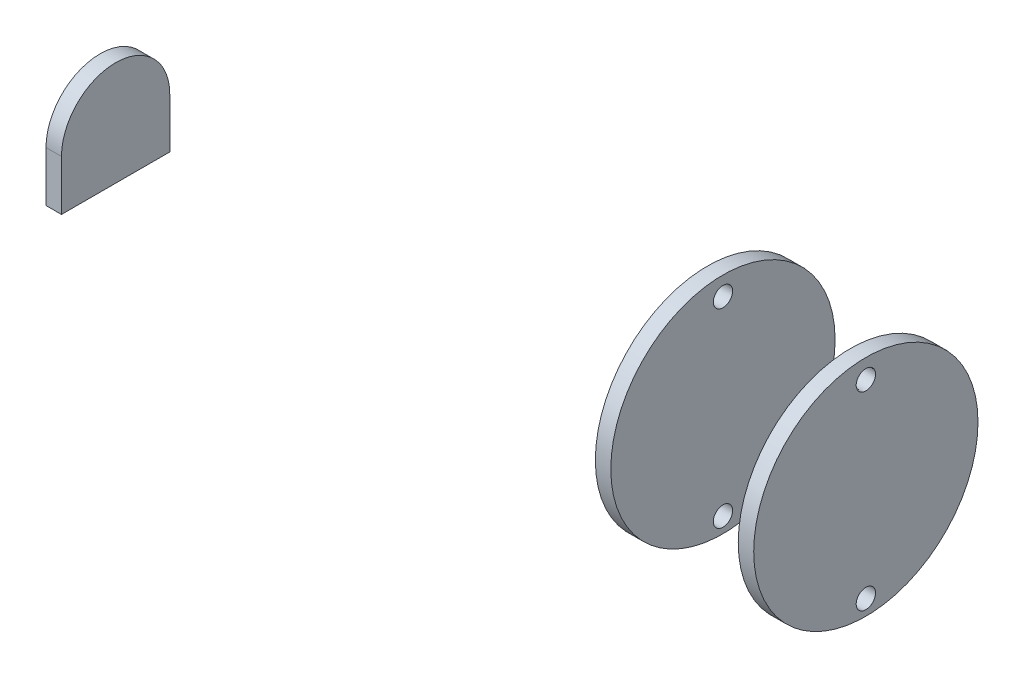
ISO-10303-21;
HEADER;
FILE_DESCRIPTION(('STEP AP214'),'2;1');
FILE_NAME('part.step','',(''),(''),'','','');
FILE_SCHEMA(('AUTOMOTIVE_DESIGN { 1 0 10303 214 1 1 1 1 }'));
ENDSEC;
DATA;
#1=APPLICATION_CONTEXT('core data for automotive mechanical design processes');
#2=APPLICATION_PROTOCOL_DEFINITION('international standard','automotive_design',2000,#1);
#3=PRODUCT_CONTEXT('',#1,'mechanical');
#4=PRODUCT('Part','Part','',(#3));
#5=PRODUCT_RELATED_PRODUCT_CATEGORY('part','',(#4));
#6=PRODUCT_DEFINITION_FORMATION('','',#4);
#7=PRODUCT_DEFINITION_CONTEXT('part definition',#1,'design');
#8=PRODUCT_DEFINITION('design','',#6,#7);
#9=PRODUCT_DEFINITION_SHAPE('','',#8);
#10=(LENGTH_UNIT() NAMED_UNIT(*) SI_UNIT(.MILLI.,.METRE.));
#11=(NAMED_UNIT(*) PLANE_ANGLE_UNIT() SI_UNIT($,.RADIAN.));
#12=(NAMED_UNIT(*) SI_UNIT($,.STERADIAN.) SOLID_ANGLE_UNIT());
#13=UNCERTAINTY_MEASURE_WITH_UNIT(LENGTH_MEASURE(1.E-05),#10,'distance_accuracy_value','');
#14=(GEOMETRIC_REPRESENTATION_CONTEXT(3) GLOBAL_UNCERTAINTY_ASSIGNED_CONTEXT((#13)) GLOBAL_UNIT_ASSIGNED_CONTEXT((#10,
#11,#12)) REPRESENTATION_CONTEXT('',''));
#15=CARTESIAN_POINT('',(0.,0.,0.));
#16=DIRECTION('',(0.,0.,1.));
#17=DIRECTION('',(1.,0.,0.));
#18=AXIS2_PLACEMENT_3D('',#15,#16,#17);
#19=CARTESIAN_POINT('',(4.,22.9784892037643,-14.));
#20=DIRECTION('',(1.,0.,0.));
#21=DIRECTION('',(0.,0.,-1.));
#22=AXIS2_PLACEMENT_3D('',#19,#20,#21);
#23=PLANE('',#22);
#24=DIRECTION('',(0.,1.,0.));
#25=VECTOR('',#24,1.);
#26=CARTESIAN_POINT('',(4.,0.,0.));
#27=LINE('',#26,#25);
#28=CARTESIAN_POINT('',(4.,0.,0.));
#29=VERTEX_POINT('',#28);
#30=CARTESIAN_POINT('',(4.,13.,0.));
#31=VERTEX_POINT('',#30);
#32=EDGE_CURVE('E54',#29,#31,#27,.T.);
#33=ORIENTED_EDGE('',*,*,#32,.F.);
#34=DIRECTION('',(0.,0.,-1.));
#35=VECTOR('',#34,1.);
#36=CARTESIAN_POINT('',(4.,0.,0.));
#37=LINE('',#36,#35);
#38=CARTESIAN_POINT('',(4.,0.,-28.));
#39=VERTEX_POINT('',#38);
#40=EDGE_CURVE('E118',#29,#39,#37,.T.);
#41=ORIENTED_EDGE('',*,*,#40,.T.);
#42=DIRECTION('',(0.,1.,0.));
#43=VECTOR('',#42,1.);
#44=CARTESIAN_POINT('',(4.,0.,-28.));
#45=LINE('',#44,#43);
#46=CARTESIAN_POINT('',(4.,13.,-28.));
#47=VERTEX_POINT('',#46);
#48=EDGE_CURVE('E86',#39,#47,#45,.T.);
#49=ORIENTED_EDGE('',*,*,#48,.T.);
#50=CARTESIAN_POINT('',(4.,13.,-14.));
#51=DIRECTION('',(-1.,0.,0.));
#52=DIRECTION('',(0.,0.,1.));
#53=AXIS2_PLACEMENT_3D('',#50,#51,#52);
#54=CIRCLE('',#53,14.);
#55=EDGE_CURVE('E120',#31,#47,#54,.T.);
#56=ORIENTED_EDGE('',*,*,#55,.F.);
#57=EDGE_LOOP('',(#33,#41,#49,#56));
#58=FACE_BOUND('',#57,.T.);
#59=ADVANCED_FACE('F51',(#58),#23,.T.);
#60=CARTESIAN_POINT('',(0.,13.,-14.));
#61=DIRECTION('',(-1.,0.,0.));
#62=DIRECTION('',(0.,0.,1.));
#63=AXIS2_PLACEMENT_3D('',#60,#61,#62);
#64=PLANE('',#63);
#65=DIRECTION('',(0.,1.,0.));
#66=VECTOR('',#65,1.);
#67=CARTESIAN_POINT('',(0.,0.,0.));
#68=LINE('',#67,#66);
#69=CARTESIAN_POINT('',(0.,0.,0.));
#70=VERTEX_POINT('',#69);
#71=CARTESIAN_POINT('',(0.,13.,0.));
#72=VERTEX_POINT('',#71);
#73=EDGE_CURVE('E13',#70,#72,#68,.T.);
#74=ORIENTED_EDGE('',*,*,#73,.T.);
#75=CARTESIAN_POINT('',(0.,13.,-14.));
#76=DIRECTION('',(-1.,0.,0.));
#77=DIRECTION('',(0.,0.,1.));
#78=AXIS2_PLACEMENT_3D('',#75,#76,#77);
#79=CIRCLE('',#78,14.);
#80=CARTESIAN_POINT('',(0.,13.,-28.));
#81=VERTEX_POINT('',#80);
#82=EDGE_CURVE('E60',#72,#81,#79,.T.);
#83=ORIENTED_EDGE('',*,*,#82,.T.);
#84=DIRECTION('',(0.,1.,0.));
#85=VECTOR('',#84,1.);
#86=CARTESIAN_POINT('',(0.,0.,-28.));
#87=LINE('',#86,#85);
#88=CARTESIAN_POINT('',(0.,0.,-28.));
#89=VERTEX_POINT('',#88);
#90=EDGE_CURVE('E105',#89,#81,#87,.T.);
#91=ORIENTED_EDGE('',*,*,#90,.F.);
#92=DIRECTION('',(0.,0.,-1.));
#93=VECTOR('',#92,1.);
#94=CARTESIAN_POINT('',(0.,0.,0.));
#95=LINE('',#94,#93);
#96=EDGE_CURVE('E99',#70,#89,#95,.T.);
#97=ORIENTED_EDGE('',*,*,#96,.F.);
#98=EDGE_LOOP('',(#74,#83,#91,#97));
#99=FACE_BOUND('',#98,.T.);
#100=ADVANCED_FACE('F113',(#99),#64,.T.);
#101=CARTESIAN_POINT('',(4.,13.,-14.));
#102=DIRECTION('',(-1.,0.,0.));
#103=DIRECTION('',(0.,0.,1.));
#104=AXIS2_PLACEMENT_3D('',#101,#102,#103);
#105=CYLINDRICAL_SURFACE('',#104,14.);
#106=ORIENTED_EDGE('',*,*,#82,.F.);
#107=DIRECTION('',(-1.,0.,0.));
#108=VECTOR('',#107,1.);
#109=CARTESIAN_POINT('',(4.,13.,0.));
#110=LINE('',#109,#108);
#111=EDGE_CURVE('E69',#31,#72,#110,.T.);
#112=ORIENTED_EDGE('',*,*,#111,.F.);
#113=ORIENTED_EDGE('',*,*,#55,.T.);
#114=DIRECTION('',(-1.,0.,0.));
#115=VECTOR('',#114,1.);
#116=CARTESIAN_POINT('',(4.,13.,-28.));
#117=LINE('',#116,#115);
#118=EDGE_CURVE('E111',#47,#81,#117,.T.);
#119=ORIENTED_EDGE('',*,*,#118,.T.);
#120=EDGE_LOOP('',(#106,#112,#113,#119));
#121=FACE_BOUND('',#120,.T.);
#122=ADVANCED_FACE('F127',(#121),#105,.T.);
#123=CARTESIAN_POINT('',(4.,0.,-28.));
#124=DIRECTION('',(0.,0.,1.));
#125=DIRECTION('',(1.,0.,0.));
#126=AXIS2_PLACEMENT_3D('',#123,#124,#125);
#127=PLANE('',#126);
#128=ORIENTED_EDGE('',*,*,#90,.T.);
#129=ORIENTED_EDGE('',*,*,#118,.F.);
#130=ORIENTED_EDGE('',*,*,#48,.F.);
#131=DIRECTION('',(-1.,0.,0.));
#132=VECTOR('',#131,1.);
#133=CARTESIAN_POINT('',(4.,0.,-28.));
#134=LINE('',#133,#132);
#135=EDGE_CURVE('E102',#39,#89,#134,.T.);
#136=ORIENTED_EDGE('',*,*,#135,.T.);
#137=EDGE_LOOP('',(#128,#129,#130,#136));
#138=FACE_BOUND('',#137,.T.);
#139=ADVANCED_FACE('F109',(#138),#127,.F.);
#140=CARTESIAN_POINT('',(4.,0.,0.));
#141=DIRECTION('',(0.,1.,0.));
#142=DIRECTION('',(0.,0.,1.));
#143=AXIS2_PLACEMENT_3D('',#140,#141,#142);
#144=PLANE('',#143);
#145=ORIENTED_EDGE('',*,*,#96,.T.);
#146=ORIENTED_EDGE('',*,*,#135,.F.);
#147=ORIENTED_EDGE('',*,*,#40,.F.);
#148=DIRECTION('',(-1.,0.,0.));
#149=VECTOR('',#148,1.);
#150=CARTESIAN_POINT('',(4.,0.,0.));
#151=LINE('',#150,#149);
#152=EDGE_CURVE('E96',#29,#70,#151,.T.);
#153=ORIENTED_EDGE('',*,*,#152,.T.);
#154=EDGE_LOOP('',(#145,#146,#147,#153));
#155=FACE_BOUND('',#154,.T.);
#156=ADVANCED_FACE('F101',(#155),#144,.F.);
#157=CARTESIAN_POINT('',(4.,0.,0.));
#158=DIRECTION('',(0.,0.,1.));
#159=DIRECTION('',(1.,0.,0.));
#160=AXIS2_PLACEMENT_3D('',#157,#158,#159);
#161=PLANE('',#160);
#162=ORIENTED_EDGE('',*,*,#73,.F.);
#163=ORIENTED_EDGE('',*,*,#152,.F.);
#164=ORIENTED_EDGE('',*,*,#32,.T.);
#165=ORIENTED_EDGE('',*,*,#111,.T.);
#166=EDGE_LOOP('',(#162,#163,#164,#165));
#167=FACE_BOUND('',#166,.T.);
#168=ADVANCED_FACE('F122',(#167),#161,.T.);
#169=CLOSED_SHELL('',(#59,#100,#122,#139,#156,#168));
#170=MANIFOLD_SOLID_BREP('B2',#169);
#171=CARTESIAN_POINT('',(198.,53.,-16.5));
#172=CARTESIAN_POINT('',(132.105858312229,55.6274440177669,-16.5));
#173=CARTESIAN_POINT('',(67.439191646031,45.6202737539583,-16.5));
#174=CARTESIAN_POINT('',(4.,22.9784892037643,-16.5));
#175=CARTESIAN_POINT('',(198.,58.,-16.5));
#176=CARTESIAN_POINT('',(132.105858312229,60.6274440177669,-16.5));
#177=CARTESIAN_POINT('',(67.4391916460311,50.6202737539583,-16.5));
#178=CARTESIAN_POINT('',(4.00000000000004,27.9784892037643,-16.5));
#179=CARTESIAN_POINT('',(198.,58.,-11.5));
#180=CARTESIAN_POINT('',(132.105858312229,60.6274440177669,-11.5));
#181=CARTESIAN_POINT('',(67.4391916460311,50.6202737539583,-11.5));
#182=CARTESIAN_POINT('',(4.00000000000004,27.9784892037643,-11.5));
#183=CARTESIAN_POINT('',(198.,53.,-11.5));
#184=CARTESIAN_POINT('',(132.105858312229,55.6274440177669,-11.5));
#185=CARTESIAN_POINT('',(67.439191646031,45.6202737539583,-11.5));
#186=CARTESIAN_POINT('',(4.,22.9784892037643,-11.5));
#187=CARTESIAN_POINT('',(198.,48.,-11.5));
#188=CARTESIAN_POINT('',(132.105858312229,50.6274440177669,-11.5));
#189=CARTESIAN_POINT('',(67.4391916460311,40.6202737539583,-11.5));
#190=CARTESIAN_POINT('',(4.00000000000004,17.9784892037643,-11.5));
#191=CARTESIAN_POINT('',(198.,48.,-16.5));
#192=CARTESIAN_POINT('',(132.105858312229,50.6274440177669,-16.5));
#193=CARTESIAN_POINT('',(67.4391916460311,40.6202737539583,-16.5));
#194=CARTESIAN_POINT('',(4.00000000000004,17.9784892037643,-16.5));
#195=CARTESIAN_POINT('',(198.,53.,-16.5));
#196=CARTESIAN_POINT('',(132.105858312229,55.6274440177669,-16.5));
#197=CARTESIAN_POINT('',(67.439191646031,45.6202737539583,-16.5));
#198=CARTESIAN_POINT('',(4.,22.9784892037643,-16.5));
#199=(BOUNDED_SURFACE() B_SPLINE_SURFACE(3,3,((#171,#172,#173,#174),(#175,#176,#177,#178),(#179,
#180,#181,#182),(#183,#184,#185,#186),(#187,#188,#189,#190),(#191,#192,#193,#194),(#195,#196,
#197,#198)),.UNSPECIFIED.,.T.,.F.,.F.) B_SPLINE_SURFACE_WITH_KNOTS((4,3,4),(4,4),(0.,0.5,1.),
(0.,1.),.UNSPECIFIED.) GEOMETRIC_REPRESENTATION_ITEM() RATIONAL_B_SPLINE_SURFACE(((1.,1.,1.,1.),
(0.333333333333333,0.333333333333333,0.333333333333333,0.333333333333333),(0.333333333333333,
0.333333333333333,0.333333333333333,0.333333333333333),(1.,1.,1.,1.),(0.333333333333333,
0.333333333333333,0.333333333333333,0.333333333333333),(0.333333333333333,0.333333333333333,
0.333333333333333,0.333333333333333),(1.,1.,1.,1.))) REPRESENTATION_ITEM('') SURFACE());
#200=CARTESIAN_POINT('',(157.05,52.9999999994432,-16.5));
#201=CARTESIAN_POINT('',(157.05,53.1404261043595,-16.4999937728862));
#202=CARTESIAN_POINT('',(157.05,53.2809540314355,-16.4881286048416));
#203=CARTESIAN_POINT('',(157.05,53.5581396579359,-16.440960749029));
#204=CARTESIAN_POINT('',(157.05,53.6947924927083,-16.4056298530893));
#205=CARTESIAN_POINT('',(157.05,53.960172122005,-16.3125363302312));
#206=CARTESIAN_POINT('',(157.05,54.0889026679691,-16.254784416507));
#207=CARTESIAN_POINT('',(157.05,54.3348047615994,-16.1185029385686));
#208=CARTESIAN_POINT('',(157.05,54.4519791735517,-16.0399785408492));
#209=CARTESIAN_POINT('',(157.05,54.6714963723232,-15.8643652589915));
#210=CARTESIAN_POINT('',(157.05,54.7738376058664,-15.7672744331104));
#211=CARTESIAN_POINT('',(157.05,54.9607710891644,-15.5572853703431));
#212=CARTESIAN_POINT('',(157.05,55.0453626419204,-15.4443865129933));
#213=CARTESIAN_POINT('',(157.05,55.1943892599242,-15.2059915357711));
#214=CARTESIAN_POINT('',(157.05,55.2588247005431,-15.080495650553));
#215=CARTESIAN_POINT('',(157.05,55.3657119037032,-14.8204675752056));
#216=CARTESIAN_POINT('',(157.05,55.4081637104493,-14.6859354032473));
#217=CARTESIAN_POINT('',(157.05,55.469878844577,-14.4116532357651));
#218=CARTESIAN_POINT('',(157.05,55.489142127753,-14.2719032302947));
#219=CARTESIAN_POINT('',(157.05,55.5039332185162,-13.9911529906131));
#220=CARTESIAN_POINT('',(157.05,55.4994610688723,-13.8501527586551));
#221=CARTESIAN_POINT('',(157.05,55.4669083399253,-13.5709043388933));
#222=CARTESIAN_POINT('',(157.05,55.438827751813,-13.4326561521163));
#223=CARTESIAN_POINT('',(157.05,55.3598552162111,-13.162836189767));
#224=CARTESIAN_POINT('',(157.05,55.3089632446418,-13.0312644212425));
#225=CARTESIAN_POINT('',(157.05,55.1858126309689,-12.778532433381));
#226=CARTESIAN_POINT('',(157.05,55.1135539958184,-12.6573722106559));
#227=CARTESIAN_POINT('',(157.05,54.9497212931497,-12.4289026964411));
#228=CARTESIAN_POINT('',(157.05,54.8581472334495,-12.321593399345));
#229=CARTESIAN_POINT('',(157.05,54.6582831675774,-12.123871859384));
#230=CARTESIAN_POINT('',(157.05,54.5499931591146,-12.0334596188348));
#231=CARTESIAN_POINT('',(157.05,54.3197712243243,-11.872098737039));
#232=CARTESIAN_POINT('',(157.05,54.1978392962139,-11.801150098336));
#233=CARTESIAN_POINT('',(157.05,53.9437948285054,-11.6807304620001));
#234=CARTESIAN_POINT('',(157.05,53.8116822893431,-11.6312594634476));
#235=CARTESIAN_POINT('',(157.05,53.54102688778,-11.5551994409436));
#236=CARTESIAN_POINT('',(157.05,53.4024840256689,-11.5286104159612));
#237=CARTESIAN_POINT('',(157.05,53.1229007970182,-11.4990691210236));
#238=CARTESIAN_POINT('',(157.05,52.9818604304786,-11.4961168510684));
#239=CARTESIAN_POINT('',(157.05,52.7012859077818,-11.5139328728519));
#240=CARTESIAN_POINT('',(157.05,52.5617517516923,-11.5347011656592));
#241=CARTESIAN_POINT('',(157.05,52.288150615102,-11.5993687653143));
#242=CARTESIAN_POINT('',(157.05,52.1540836348352,-11.6432680731523));
#243=CARTESIAN_POINT('',(157.05,51.8952226410949,-11.752951523829));
#244=CARTESIAN_POINT('',(157.05,51.7704286264096,-11.8187356638077));
#245=CARTESIAN_POINT('',(157.05,51.5336560954249,-11.9703213516628));
#246=CARTESIAN_POINT('',(157.05,51.4216775773691,-12.0561228967962));
#247=CARTESIAN_POINT('',(157.05,51.2137147172355,-12.2453077857127));
#248=CARTESIAN_POINT('',(157.05,51.1177303816315,-12.3486911366124));
#249=CARTESIAN_POINT('',(157.05,50.9444806275006,-12.5701048986734));
#250=CARTESIAN_POINT('',(157.05,50.8672152150653,-12.6881353146012));
#251=CARTESIAN_POINT('',(157.05,50.733596758834,-12.9354925089901));
#252=CARTESIAN_POINT('',(157.05,50.6772436929629,-13.0648192755265));
#253=CARTESIAN_POINT('',(157.05,50.5870495271942,-13.3310980252657));
#254=CARTESIAN_POINT('',(157.05,50.5532084188964,-13.4680500056232));
#255=CARTESIAN_POINT('',(157.05,50.5089987445027,-13.7456918218851));
#256=CARTESIAN_POINT('',(157.05,50.4986302207022,-13.8863816645245));
#257=CARTESIAN_POINT('',(157.05,50.5016601630131,-14.1675049197502));
#258=CARTESIAN_POINT('',(157.05,50.5150585838162,-14.307938332825));
#259=CARTESIAN_POINT('',(157.05,50.5652420606733,-14.5845627945393));
#260=CARTESIAN_POINT('',(157.05,50.6020271637533,-14.7207538346478));
#261=CARTESIAN_POINT('',(157.05,50.697940631483,-14.985029646531));
#262=CARTESIAN_POINT('',(157.05,50.757069412255,-15.1131142672821));
#263=CARTESIAN_POINT('',(157.05,50.8959892404141,-15.3575336098147));
#264=CARTESIAN_POINT('',(157.05,50.9757794765226,-15.4738687926923));
#265=CARTESIAN_POINT('',(157.05,51.153747708474,-15.6914811400843));
#266=CARTESIAN_POINT('',(157.05,51.2519237795349,-15.7927598788432));
#267=CARTESIAN_POINT('',(157.05,51.4639142410194,-15.9774231538072));
#268=CARTESIAN_POINT('',(157.05,51.5777325122274,-16.0608032362146));
#269=CARTESIAN_POINT('',(157.05,51.8177962737874,-16.2073028677138));
#270=CARTESIAN_POINT('',(157.05,51.944047671695,-16.2704127241992));
#271=CARTESIAN_POINT('',(157.05,52.2052547562593,-16.374468176405));
#272=CARTESIAN_POINT('',(157.05,52.340199790446,-16.4154403407286));
#273=CARTESIAN_POINT('',(157.05,52.5633373622049,-16.4631373617696));
#274=CARTESIAN_POINT('',(157.05,52.6500800016856,-16.476943599119));
#275=CARTESIAN_POINT('',(157.05,52.8245351734008,-16.4953768638963));
#276=CARTESIAN_POINT('',(157.05,52.9122477056354,-16.5000038913243));
#277=CARTESIAN_POINT('',(157.05,52.9999999994432,-16.5));
#278=B_SPLINE_CURVE_WITH_KNOTS('',3,(#200,#201,#202,#203,#204,#205,#206,#207,#208,#209,#210,
#211,#212,#213,#214,#215,#216,#217,#218,#219,#220,#221,#222,#223,#224,#225,#226,#227,#228,#229,
#230,#231,#232,#233,#234,#235,#236,#237,#238,#239,#240,#241,#242,#243,#244,#245,#246,#247,#248,
#249,#250,#251,#252,#253,#254,#255,#256,#257,#258,#259,#260,#261,#262,#263,#264,#265,#266,#267,
#268,#269,#270,#271,#272,#273,#274,#275,#276,#277),.UNSPECIFIED.,.T.,.F.,(4,2,2,2,2,2,2,2,2,2,2,
2,2,2,2,2,2,2,2,2,2,2,2,2,2,2,2,2,2,2,2,2,2,2,2,2,2,2,4),(0.,0.420958019060008,
0.842422990225468,1.263686824675,1.68484598149468,2.10604920874261,2.5272689728092,
2.94848089195513,3.36969196412491,3.79090383927354,4.21211495544062,4.63332622878121,
5.05453794675634,5.4757495276603,5.89696093807203,6.31817240620724,6.73938392938772,
7.16059543453334,7.58180692070297,8.00301840687307,8.42422991201912,8.84544143519961,
9.26665290333484,9.68786431374657,10.1090758946505,10.5302876126257,10.9514988859662,
11.3727100021333,11.7939218772819,12.2151329494517,12.6363448685976,13.0575646326642,
13.4787678599122,13.8999270167319,14.3211908511814,14.7426558223468,15.1636138414067,
15.4266705700068,15.6897272986068),.UNSPECIFIED.);
#279=CARTESIAN_POINT('',(157.05,52.9999999994432,-16.5));
#280=VERTEX_POINT('',#279);
#281=EDGE_CURVE('E198',#280,#280,#278,.T.);
#282=CARTESIAN_POINT('',(161.05,53.1449283490421,-16.5));
#283=CARTESIAN_POINT('',(161.05,53.2853544539584,-16.4999937728862));
#284=CARTESIAN_POINT('',(161.05,53.4258823810344,-16.4881286048416));
#285=CARTESIAN_POINT('',(161.05,53.7030680075347,-16.440960749029));
#286=CARTESIAN_POINT('',(161.05,53.8397208423072,-16.4056298530893));
#287=CARTESIAN_POINT('',(161.05,54.1051004716038,-16.3125363302312));
#288=CARTESIAN_POINT('',(161.05,54.2338310175679,-16.254784416507));
#289=CARTESIAN_POINT('',(161.05,54.4797331111983,-16.1185029385686));
#290=CARTESIAN_POINT('',(161.05,54.5969075231506,-16.0399785408492));
#291=CARTESIAN_POINT('',(161.05,54.8164247219221,-15.8643652589915));
#292=CARTESIAN_POINT('',(161.05,54.9187659554653,-15.7672744331104));
#293=CARTESIAN_POINT('',(161.05,55.1056994387633,-15.5572853703431));
#294=CARTESIAN_POINT('',(161.05,55.1902909915193,-15.4443865129933));
#295=CARTESIAN_POINT('',(161.05,55.3393176095231,-15.2059915357711));
#296=CARTESIAN_POINT('',(161.05,55.4037530501419,-15.080495650553));
#297=CARTESIAN_POINT('',(161.05,55.5106402533021,-14.8204675752057));
#298=CARTESIAN_POINT('',(161.05,55.5530920600481,-14.6859354032473));
#299=CARTESIAN_POINT('',(161.05,55.6148071941759,-14.4116532357651));
#300=CARTESIAN_POINT('',(161.05,55.6340704773519,-14.2719032302947));
#301=CARTESIAN_POINT('',(161.05,55.6488615681151,-13.9911529906131));
#302=CARTESIAN_POINT('',(161.05,55.6443894184711,-13.8501527586551));
#303=CARTESIAN_POINT('',(161.05,55.6118366895242,-13.5709043388933));
#304=CARTESIAN_POINT('',(161.05,55.5837561014118,-13.4326561521164));
#305=CARTESIAN_POINT('',(161.05,55.50478356581,-13.1628361897671));
#306=CARTESIAN_POINT('',(161.05,55.4538915942407,-13.0312644212425));
#307=CARTESIAN_POINT('',(161.05,55.3307409805678,-12.778532433381));
#308=CARTESIAN_POINT('',(161.05,55.2584823454173,-12.657372210656));
#309=CARTESIAN_POINT('',(161.05,55.0946496427485,-12.4289026964412));
#310=CARTESIAN_POINT('',(161.05,55.0030755830484,-12.321593399345));
#311=CARTESIAN_POINT('',(161.05,54.8032115171763,-12.1238718593841));
#312=CARTESIAN_POINT('',(161.05,54.6949215087135,-12.0334596188348));
#313=CARTESIAN_POINT('',(161.05,54.4646995739232,-11.872098737039));
#314=CARTESIAN_POINT('',(161.05,54.3427676458128,-11.801150098336));
#315=CARTESIAN_POINT('',(161.05,54.0887231781043,-11.6807304620001));
#316=CARTESIAN_POINT('',(161.05,53.956610638942,-11.6312594634476));
#317=CARTESIAN_POINT('',(161.05,53.6859552373789,-11.5551994409436));
#318=CARTESIAN_POINT('',(161.05,53.5474123752678,-11.5286104159612));
#319=CARTESIAN_POINT('',(161.05,53.2678291466171,-11.4990691210236));
#320=CARTESIAN_POINT('',(161.05,53.1267887800775,-11.4961168510684));
#321=CARTESIAN_POINT('',(161.05,52.8462142573807,-11.5139328728519));
#322=CARTESIAN_POINT('',(161.05,52.7066801012912,-11.5347011656592));
#323=CARTESIAN_POINT('',(161.05,52.4330789647009,-11.5993687653142));
#324=CARTESIAN_POINT('',(161.05,52.2990119844341,-11.6432680731523));
#325=CARTESIAN_POINT('',(161.05,52.0401509906938,-11.752951523829));
#326=CARTESIAN_POINT('',(161.05,51.9153569760085,-11.8187356638076));
#327=CARTESIAN_POINT('',(161.05,51.6785844450237,-11.9703213516628));
#328=CARTESIAN_POINT('',(161.05,51.566605926968,-12.0561228967961));
#329=CARTESIAN_POINT('',(161.05,51.3586430668344,-12.2453077857127));
#330=CARTESIAN_POINT('',(161.05,51.2626587312304,-12.3486911366124));
#331=CARTESIAN_POINT('',(161.05,51.0894089770995,-12.5701048986734));
#332=CARTESIAN_POINT('',(161.05,51.0121435646642,-12.6881353146012));
#333=CARTESIAN_POINT('',(161.05,50.8785251084329,-12.9354925089901));
#334=CARTESIAN_POINT('',(161.05,50.8221720425618,-13.0648192755265));
#335=CARTESIAN_POINT('',(161.05,50.7319778767931,-13.3310980252657));
#336=CARTESIAN_POINT('',(161.05,50.6981367684953,-13.4680500056232));
#337=CARTESIAN_POINT('',(161.05,50.6539270941016,-13.7456918218851));
#338=CARTESIAN_POINT('',(161.05,50.6435585703011,-13.8863816645244));
#339=CARTESIAN_POINT('',(161.05,50.6465885126119,-14.1675049197502));
#340=CARTESIAN_POINT('',(161.05,50.6599869334151,-14.3079383328249));
#341=CARTESIAN_POINT('',(161.05,50.7101704102722,-14.5845627945393));
#342=CARTESIAN_POINT('',(161.05,50.7469555133522,-14.7207538346478));
#343=CARTESIAN_POINT('',(161.05,50.8428689810819,-14.9850296465309));
#344=CARTESIAN_POINT('',(161.05,50.9019977618539,-15.1131142672821));
#345=CARTESIAN_POINT('',(161.05,51.040917590013,-15.3575336098147));
#346=CARTESIAN_POINT('',(161.05,51.1207078261214,-15.4738687926923));
#347=CARTESIAN_POINT('',(161.05,51.2986760580728,-15.6914811400843));
#348=CARTESIAN_POINT('',(161.05,51.3968521291338,-15.7927598788432));
#349=CARTESIAN_POINT('',(161.05,51.6088425906183,-15.9774231538072));
#350=CARTESIAN_POINT('',(161.05,51.7226608618262,-16.0608032362146));
#351=CARTESIAN_POINT('',(161.05,51.9627246233863,-16.2073028677138));
#352=CARTESIAN_POINT('',(161.05,52.0889760212939,-16.2704127241992));
#353=CARTESIAN_POINT('',(161.05,52.3501831058582,-16.374468176405));
#354=CARTESIAN_POINT('',(161.05,52.4851281400449,-16.4154403407286));
#355=CARTESIAN_POINT('',(161.05,52.7082657118038,-16.4631373617696));
#356=CARTESIAN_POINT('',(161.05,52.7950083512845,-16.476943599119));
#357=CARTESIAN_POINT('',(161.05,52.9694635229997,-16.4953768638963));
#358=CARTESIAN_POINT('',(161.05,53.0571760552343,-16.5000038913243));
#359=CARTESIAN_POINT('',(161.05,53.1449283490421,-16.5));
#360=B_SPLINE_CURVE_WITH_KNOTS('',3,(#282,#283,#284,#285,#286,#287,#288,#289,#290,#291,#292,
#293,#294,#295,#296,#297,#298,#299,#300,#301,#302,#303,#304,#305,#306,#307,#308,#309,#310,#311,
#312,#313,#314,#315,#316,#317,#318,#319,#320,#321,#322,#323,#324,#325,#326,#327,#328,#329,#330,
#331,#332,#333,#334,#335,#336,#337,#338,#339,#340,#341,#342,#343,#344,#345,#346,#347,#348,#349,
#350,#351,#352,#353,#354,#355,#356,#357,#358,#359),.UNSPECIFIED.,.T.,.F.,(4,2,2,2,2,2,2,2,2,2,2,
2,2,2,2,2,2,2,2,2,2,2,2,2,2,2,2,2,2,2,2,2,2,2,2,2,2,2,4),(0.,0.420958019059994,
0.842422990225434,1.26368682467497,1.68484598149463,2.10604920874259,2.52726897280919,
2.94848089195511,3.36969196412488,3.79090383927351,4.21211495544059,4.63332622878117,
5.05453794675629,5.47574952766026,5.89696093807199,6.31817240620721,6.73938392938769,
7.16059543453331,7.58180692070296,8.00301840687304,8.42422991201908,8.84544143519958,
9.26665290333481,9.68786431374655,10.1090758946505,10.5302876126256,10.9514988859662,
11.3727100021333,11.7939218772819,12.2151329494517,12.6363448685976,13.0575646326642,
13.4787678599121,13.8999270167318,14.3211908511814,14.7426558223468,15.1636138414067,
15.4266705700068,15.6897272986068),.UNSPECIFIED.);
#361=CARTESIAN_POINT('',(161.05,53.1449283490421,-16.5));
#362=VERTEX_POINT('',#361);
#363=EDGE_CURVE('E208',#362,#362,#360,.T.);
#364=CARTESIAN_POINT('',(157.05,52.9999999994432,-16.5));
#365=CARTESIAN_POINT('',(157.091651019367,53.0016737477256,-16.5));
#366=CARTESIAN_POINT('',(157.133302245239,53.003342357147,-16.5));
#367=CARTESIAN_POINT('',(157.216605693185,53.0066693219946,-16.5));
#368=CARTESIAN_POINT('',(157.258257915265,53.0083276772761,-16.5));
#369=CARTESIAN_POINT('',(157.341563355627,53.0116341338439,-16.5));
#370=CARTESIAN_POINT('',(157.383216573915,53.013282234985,-16.5));
#371=CARTESIAN_POINT('',(157.466524006692,53.0165681832727,-16.5));
#372=CARTESIAN_POINT('',(157.508178221187,53.0182060302734,-16.5));
#373=CARTESIAN_POINT('',(157.59148764638,53.0214714702811,-16.5));
#374=CARTESIAN_POINT('',(157.633142857083,53.0230990631416,-16.5));
#375=CARTESIAN_POINT('',(157.716454274691,53.0263439948692,-16.5));
#376=CARTESIAN_POINT('',(157.758110481602,53.0279613335893,-16.5));
#377=CARTESIAN_POINT('',(157.841423891625,53.0311857570369,-16.5));
#378=CARTESIAN_POINT('',(157.883081094744,53.0327928416167,-16.5));
#379=CARTESIAN_POINT('',(157.966396497183,53.0359967567843,-16.5));
#380=CARTESIAN_POINT('',(158.008054696509,53.0375935872238,-16.5));
#381=CARTESIAN_POINT('',(158.091372091364,53.0407769941113,-16.5));
#382=CARTESIAN_POINT('',(158.133031286898,53.0423635704105,-16.5));
#383=CARTESIAN_POINT('',(158.216350674168,53.045526469018,-16.5));
#384=CARTESIAN_POINT('',(158.25801086591,53.0471027911768,-16.5));
#385=CARTESIAN_POINT('',(158.341332245595,53.0502451815042,-16.5));
#386=CARTESIAN_POINT('',(158.382993433544,53.0518112495227,-16.5));
#387=CARTESIAN_POINT('',(158.466316805645,53.0549331315702,-16.5));
#388=CARTESIAN_POINT('',(158.507978989803,53.0564889454483,-16.5));
#389=CARTESIAN_POINT('',(158.591304354319,53.0595903192157,-16.5));
#390=CARTESIAN_POINT('',(158.632967534684,53.0611358789535,-16.5));
#391=CARTESIAN_POINT('',(158.716294891616,53.0642167444409,-16.5));
#392=CARTESIAN_POINT('',(158.757959068188,53.0657520500384,-16.5));
#393=CARTESIAN_POINT('',(158.841288417536,53.0688124072457,-16.5));
#394=CARTESIAN_POINT('',(158.882953590316,53.0703374587029,-16.5));
#395=CARTESIAN_POINT('',(158.966284932079,53.0733773076302,-16.5));
#396=CARTESIAN_POINT('',(159.007951101067,53.0748921049471,-16.5));
#397=CARTESIAN_POINT('',(159.091284435245,53.0779114455943,-16.5));
#398=CARTESIAN_POINT('',(159.132951600441,53.0794159887709,-16.5));
#399=CARTESIAN_POINT('',(159.216286927034,53.0824148211381,-16.5));
#400=CARTESIAN_POINT('',(159.257955088438,53.0839091101743,-16.5));
#401=CARTESIAN_POINT('',(159.341292407447,53.0868874342615,-16.5));
#402=CARTESIAN_POINT('',(159.382961565058,53.0883714691573,-16.5));
#403=CARTESIAN_POINT('',(159.466300876483,53.0913292849645,-16.5));
#404=CARTESIAN_POINT('',(159.507971030302,53.09280306572,-16.5));
#405=CARTESIAN_POINT('',(159.591312334142,53.0957403732472,-16.5));
#406=CARTESIAN_POINT('',(159.632983484168,53.0972038998624,-16.5));
#407=CARTESIAN_POINT('',(159.716326780424,53.1001206991095,-16.5));
#408=CARTESIAN_POINT('',(159.757998926658,53.1015739715844,-16.5));
#409=CARTESIAN_POINT('',(159.841344215329,53.1044702625514,-16.5));
#410=CARTESIAN_POINT('',(159.883017357771,53.105913280886,-16.5));
#411=CARTESIAN_POINT('',(159.966364638858,53.108789063573,-16.5));
#412=CARTESIAN_POINT('',(160.008038777508,53.1102218277672,-16.5));
#413=CARTESIAN_POINT('',(160.09138805101,53.1130771021742,-16.5));
#414=CARTESIAN_POINT('',(160.133063185867,53.1144996122281,-16.5));
#415=CARTESIAN_POINT('',(160.216414451784,53.1173343783551,-16.5));
#416=CARTESIAN_POINT('',(160.25809058285,53.1187466342687,-16.5));
#417=CARTESIAN_POINT('',(160.341443841182,53.1215608921156,-16.5));
#418=CARTESIAN_POINT('',(160.383120968455,53.1229628938888,-16.5));
#419=CARTESIAN_POINT('',(160.466476219204,53.1257566434558,-16.5));
#420=CARTESIAN_POINT('',(160.508154342684,53.1271483910887,-16.5));
#421=CARTESIAN_POINT('',(160.591511585848,53.1299216323755,-16.5));
#422=CARTESIAN_POINT('',(160.633190705537,53.1313031258681,-16.5));
#423=CARTESIAN_POINT('',(160.716549941116,53.1340558588749,-16.5));
#424=CARTESIAN_POINT('',(160.758230057012,53.1354270982272,-16.5));
#425=CARTESIAN_POINT('',(160.841591285007,53.138159322954,-16.5));
#426=CARTESIAN_POINT('',(160.88327239711,53.1395203081658,-16.5));
#427=CARTESIAN_POINT('',(160.96663561752,53.1422320246128,-16.5));
#428=CARTESIAN_POINT('',(161.008317725832,53.1435827556848,-16.5));
#429=CARTESIAN_POINT('',(161.05,53.1449283490421,-16.5));
#430=B_SPLINE_CURVE_WITH_KNOTS('',3,(#364,#365,#366,#367,#368,#369,#370,#371,#372,#373,#374,
#375,#376,#377,#378,#379,#380,#381,#382,#383,#384,#385,#386,#387,#388,#389,#390,#391,#392,#393,
#394,#395,#396,#397,#398,#399,#400,#401,#402,#403,#404,#405,#406,#407,#408,#409,#410,#411,#412,
#413,#414,#415,#416,#417,#418,#419,#420,#421,#422,#423,#424,#425,#426,#427,#428,#429),
.UNSPECIFIED.,.F.,.F.,(4,2,2,2,2,2,2,2,2,2,2,2,2,2,2,2,2,2,2,2,2,2,2,2,2,2,2,2,2,2,2,2,4),(0.,
0.125053906572797,0.250109571780392,0.375167003236639,0.500226208554819,0.625287195348417,
0.75034997123004,0.875414543812407,1.00048092070764,1.1255491095276,1.2506191178838,
1.37569095338746,1.50076462364949,1.62584013628039,1.75091749889041,1.87599671908939,
2.00107780448688,2.12616076269192,2.25124560131356,2.37633232796016,2.50142095024001,
2.62651147576079,2.75160391213003,2.87669826695474,3.00179454784189,3.12689276239768,
3.25199291822826,3.3770950229394,3.50219908413636,3.62730510942413,3.75241310640741,
3.87752308269044,4.00263504587706),.UNSPECIFIED.);
#431=EDGE_CURVE('BSEAM184',#280,#362,#430,.T.);
#432=ORIENTED_EDGE('',*,*,#281,.F.);
#433=ORIENTED_EDGE('',*,*,#363,.T.);
#434=ORIENTED_EDGE('',*,*,#431,.T.);
#435=ORIENTED_EDGE('',*,*,#431,.F.);
#436=EDGE_LOOP('',(#432,#434,#433,#435));
#437=FACE_BOUND('',#436,.T.);
#438=ADVANCED_FACE('F184',(#437),#199,.T.);
#439=CARTESIAN_POINT('',(161.05,29.,-14.));
#440=DIRECTION('',(-1.,0.,0.));
#441=DIRECTION('',(0.,0.,1.));
#442=AXIS2_PLACEMENT_3D('',#439,#440,#441);
#443=CYLINDRICAL_SURFACE('',#442,29.);
#444=CARTESIAN_POINT('',(161.05,29.,-14.));
#445=DIRECTION('',(1.,0.,0.));
#446=DIRECTION('',(0.,0.,-1.));
#447=AXIS2_PLACEMENT_3D('',#444,#445,#446);
#448=CIRCLE('',#447,29.);
#449=CARTESIAN_POINT('',(161.05,29.,-43.));
#450=VERTEX_POINT('',#449);
#451=EDGE_CURVE('E193',#450,#450,#448,.T.);
#452=ORIENTED_EDGE('',*,*,#451,.F.);
#453=EDGE_LOOP('',(#452));
#454=FACE_BOUND('',#453,.T.);
#455=CARTESIAN_POINT('',(157.05,29.,-14.));
#456=DIRECTION('',(1.,0.,0.));
#457=DIRECTION('',(0.,0.,-1.));
#458=AXIS2_PLACEMENT_3D('',#455,#456,#457);
#459=CIRCLE('',#458,29.);
#460=CARTESIAN_POINT('',(157.05,29.,-43.));
#461=VERTEX_POINT('',#460);
#462=EDGE_CURVE('E50',#461,#461,#459,.T.);
#463=ORIENTED_EDGE('',*,*,#462,.T.);
#464=EDGE_LOOP('',(#463));
#465=FACE_BOUND('',#464,.T.);
#466=ADVANCED_FACE('F219',(#454,#465),#443,.T.);
#467=CARTESIAN_POINT('',(157.05,29.,-14.));
#468=DIRECTION('',(1.,0.,0.));
#469=DIRECTION('',(0.,0.,-1.));
#470=AXIS2_PLACEMENT_3D('',#467,#468,#469);
#471=PLANE('',#470);
#472=CARTESIAN_POINT('',(157.05,4.,-14.));
#473=DIRECTION('',(1.,0.,0.));
#474=DIRECTION('',(0.,0.,-1.));
#475=AXIS2_PLACEMENT_3D('',#472,#473,#474);
#476=CIRCLE('',#475,2.5);
#477=CARTESIAN_POINT('',(157.05,4.,-16.5));
#478=VERTEX_POINT('',#477);
#479=EDGE_CURVE('E201',#478,#478,#476,.T.);
#480=ORIENTED_EDGE('',*,*,#479,.T.);
#481=EDGE_LOOP('',(#480));
#482=FACE_BOUND('',#481,.T.);
#483=ORIENTED_EDGE('',*,*,#462,.F.);
#484=EDGE_LOOP('',(#483));
#485=FACE_BOUND('',#484,.T.);
#486=ORIENTED_EDGE('',*,*,#281,.T.);
#487=EDGE_LOOP('',(#486));
#488=FACE_BOUND('',#487,.T.);
#489=ADVANCED_FACE('F216',(#482,#485,#488),#471,.F.);
#490=CARTESIAN_POINT('',(161.05,29.,-14.));
#491=DIRECTION('',(1.,0.,0.));
#492=DIRECTION('',(0.,0.,-1.));
#493=AXIS2_PLACEMENT_3D('',#490,#491,#492);
#494=PLANE('',#493);
#495=CARTESIAN_POINT('',(161.05,4.,-14.));
#496=DIRECTION('',(1.,0.,0.));
#497=DIRECTION('',(0.,0.,-1.));
#498=AXIS2_PLACEMENT_3D('',#495,#496,#497);
#499=CIRCLE('',#498,2.5);
#500=CARTESIAN_POINT('',(161.05,4.,-16.5));
#501=VERTEX_POINT('',#500);
#502=EDGE_CURVE('E189',#501,#501,#499,.T.);
#503=ORIENTED_EDGE('',*,*,#502,.F.);
#504=EDGE_LOOP('',(#503));
#505=FACE_BOUND('',#504,.T.);
#506=ORIENTED_EDGE('',*,*,#451,.T.);
#507=EDGE_LOOP('',(#506));
#508=FACE_BOUND('',#507,.T.);
#509=ORIENTED_EDGE('',*,*,#363,.F.);
#510=EDGE_LOOP('',(#509));
#511=FACE_BOUND('',#510,.T.);
#512=ADVANCED_FACE('F186',(#505,#508,#511),#494,.T.);
#513=CARTESIAN_POINT('',(2.06,4.,-14.));
#514=DIRECTION('',(1.,0.,0.));
#515=DIRECTION('',(0.,0.,-1.));
#516=AXIS2_PLACEMENT_3D('',#513,#514,#515);
#517=CYLINDRICAL_SURFACE('',#516,2.5);
#518=ORIENTED_EDGE('',*,*,#502,.T.);
#519=EDGE_LOOP('',(#518));
#520=FACE_BOUND('',#519,.T.);
#521=ORIENTED_EDGE('',*,*,#479,.F.);
#522=EDGE_LOOP('',(#521));
#523=FACE_BOUND('',#522,.T.);
#524=ADVANCED_FACE('F225',(#520,#523),#517,.F.);
#525=CLOSED_SHELL('',(#438,#466,#489,#512,#524));
#526=MANIFOLD_SOLID_BREP('B7',#525);
#527=CARTESIAN_POINT('',(198.,53.,-16.5));
#528=CARTESIAN_POINT('',(132.105858312229,55.6274440177669,-16.5));
#529=CARTESIAN_POINT('',(67.439191646031,45.6202737539583,-16.5));
#530=CARTESIAN_POINT('',(4.,22.9784892037643,-16.5));
#531=CARTESIAN_POINT('',(198.,58.,-16.5));
#532=CARTESIAN_POINT('',(132.105858312229,60.6274440177669,-16.5));
#533=CARTESIAN_POINT('',(67.4391916460311,50.6202737539583,-16.5));
#534=CARTESIAN_POINT('',(4.00000000000004,27.9784892037643,-16.5));
#535=CARTESIAN_POINT('',(198.,58.,-11.5));
#536=CARTESIAN_POINT('',(132.105858312229,60.6274440177669,-11.5));
#537=CARTESIAN_POINT('',(67.4391916460311,50.6202737539583,-11.5));
#538=CARTESIAN_POINT('',(4.00000000000004,27.9784892037643,-11.5));
#539=CARTESIAN_POINT('',(198.,53.,-11.5));
#540=CARTESIAN_POINT('',(132.105858312229,55.6274440177669,-11.5));
#541=CARTESIAN_POINT('',(67.439191646031,45.6202737539583,-11.5));
#542=CARTESIAN_POINT('',(4.,22.9784892037643,-11.5));
#543=CARTESIAN_POINT('',(198.,48.,-11.5));
#544=CARTESIAN_POINT('',(132.105858312229,50.6274440177669,-11.5));
#545=CARTESIAN_POINT('',(67.4391916460311,40.6202737539583,-11.5));
#546=CARTESIAN_POINT('',(4.00000000000004,17.9784892037643,-11.5));
#547=CARTESIAN_POINT('',(198.,48.,-16.5));
#548=CARTESIAN_POINT('',(132.105858312229,50.6274440177669,-16.5));
#549=CARTESIAN_POINT('',(67.4391916460311,40.6202737539583,-16.5));
#550=CARTESIAN_POINT('',(4.00000000000004,17.9784892037643,-16.5));
#551=CARTESIAN_POINT('',(198.,53.,-16.5));
#552=CARTESIAN_POINT('',(132.105858312229,55.6274440177669,-16.5));
#553=CARTESIAN_POINT('',(67.439191646031,45.6202737539583,-16.5));
#554=CARTESIAN_POINT('',(4.,22.9784892037643,-16.5));
#555=(BOUNDED_SURFACE() B_SPLINE_SURFACE(3,3,((#527,#528,#529,#530),(#531,#532,#533,#534),(#535,
#536,#537,#538),(#539,#540,#541,#542),(#543,#544,#545,#546),(#547,#548,#549,#550),(#551,#552,
#553,#554)),.UNSPECIFIED.,.T.,.F.,.F.) B_SPLINE_SURFACE_WITH_KNOTS((4,3,4),(4,4),(0.,0.5,1.),
(0.,1.),.UNSPECIFIED.) GEOMETRIC_REPRESENTATION_ITEM() RATIONAL_B_SPLINE_SURFACE(((1.,1.,1.,1.),
(0.333333333333333,0.333333333333333,0.333333333333333,0.333333333333333),(0.333333333333333,
0.333333333333333,0.333333333333333,0.333333333333333),(1.,1.,1.,1.),(0.333333333333333,
0.333333333333333,0.333333333333333,0.333333333333333),(0.333333333333333,0.333333333333333,
0.333333333333333,0.333333333333333),(1.,1.,1.,1.))) REPRESENTATION_ITEM('') SURFACE());
#556=CARTESIAN_POINT('',(193.999999997373,53.144024180194,-16.5));
#557=CARTESIAN_POINT('',(193.999999996712,53.2844502850909,-16.4999937728768));
#558=CARTESIAN_POINT('',(193.999999999119,53.4249782121466,-16.4881286048259));
#559=CARTESIAN_POINT('',(194.000000000883,53.7021638386063,-16.4409607490076));
#560=CARTESIAN_POINT('',(194.000000000236,53.8388166733584,-16.4056298530685));
#561=CARTESIAN_POINT('',(193.999999999764,54.1041963026145,-16.3125363302184));
#562=CARTESIAN_POINT('',(193.999999999937,54.2329268485585,-16.254784416502));
#563=CARTESIAN_POINT('',(194.000000000063,54.4788289421524,-16.1185029385855));
#564=CARTESIAN_POINT('',(194.000000000017,54.5960033540883,-16.0399785408801));
#565=CARTESIAN_POINT('',(193.999999999983,54.8155205528486,-15.8643652590423));
#566=CARTESIAN_POINT('',(193.999999999995,54.9178617863947,-15.7672744331643));
#567=CARTESIAN_POINT('',(194.000000000005,55.1047952696991,-15.5572853704026));
#568=CARTESIAN_POINT('',(194.000000000001,55.1893868224585,-15.4443865130554));
#569=CARTESIAN_POINT('',(193.999999999999,55.3384134404696,-15.2059915358377));
#570=CARTESIAN_POINT('',(194.,55.4028488810922,-15.0804956506215));
#571=CARTESIAN_POINT('',(194.,55.5097360842603,-14.8204675752774));
#572=CARTESIAN_POINT('',(194.,55.5521878910104,-14.6859354033203));
#573=CARTESIAN_POINT('',(194.,55.6139030251464,-14.41165323584));
#574=CARTESIAN_POINT('',(194.,55.6331663083267,-14.2719032303703));
#575=CARTESIAN_POINT('',(194.,55.6479573990984,-13.9911529906891));
#576=CARTESIAN_POINT('',(194.,55.6434852494587,-13.850152758731));
#577=CARTESIAN_POINT('',(194.,55.6109325205203,-13.5709043389682));
#578=CARTESIAN_POINT('',(194.,55.5828519324121,-13.4326561521904));
#579=CARTESIAN_POINT('',(194.,55.5038793968185,-13.1628361898387));
#580=CARTESIAN_POINT('',(194.,55.4529874252532,-13.0312644213126));
#581=CARTESIAN_POINT('',(194.,55.3298368115879,-12.7785324334473));
#582=CARTESIAN_POINT('',(194.,55.2575781764412,-12.6573722107201));
#583=CARTESIAN_POINT('',(194.,55.0937454737793,-12.4289026965003));
#584=CARTESIAN_POINT('',(194.,55.0021714140824,-12.3215933994014));
#585=CARTESIAN_POINT('',(194.,54.8023073482163,-12.1238718594344));
#586=CARTESIAN_POINT('',(194.,54.6940173397563,-12.0334596188819));
#587=CARTESIAN_POINT('',(194.,54.4637954049708,-11.8720987370791));
#588=CARTESIAN_POINT('',(194.,54.3418634768626,-11.8011500983724));
#589=CARTESIAN_POINT('',(194.,54.0878190091577,-11.6807304620288));
#590=CARTESIAN_POINT('',(194.,53.955706469997,-11.6312594634723));
#591=CARTESIAN_POINT('',(194.,53.6850510684362,-11.55519944096));
#592=CARTESIAN_POINT('',(194.,53.5465082063259,-11.5286104159734));
#593=CARTESIAN_POINT('',(194.,53.266924977676,-11.4990691210273));
#594=CARTESIAN_POINT('',(194.,53.1258846111366,-11.4961168510678));
#595=CARTESIAN_POINT('',(194.,52.8453100884392,-11.5139328728428));
#596=CARTESIAN_POINT('',(194.,52.7057759323491,-11.5347011656459));
#597=CARTESIAN_POINT('',(194.,52.4321747957568,-11.5993687652926));
#598=CARTESIAN_POINT('',(194.,52.2981078154887,-11.6432680731266));
#599=CARTESIAN_POINT('',(194.,52.0392468217451,-11.7529515237954));
#600=CARTESIAN_POINT('',(194.,51.9144528070578,-11.8187356637703));
#601=CARTESIAN_POINT('',(194.,51.6776802760684,-11.9703213516183));
#602=CARTESIAN_POINT('',(194.,51.56570175801,-12.0561228967482));
#603=CARTESIAN_POINT('',(194.,51.3577388978706,-12.2453077856585));
#604=CARTESIAN_POINT('',(194.,51.2617545622636,-12.3486911365553));
#605=CARTESIAN_POINT('',(194.,51.088504808126,-12.5701048986111));
#606=CARTESIAN_POINT('',(194.,51.011239395687,-12.6881353145365));
#607=CARTESIAN_POINT('',(194.,50.8776209394482,-12.9354925089213));
#608=CARTESIAN_POINT('',(194.,50.8212678735732,-13.0648192754561));
#609=CARTESIAN_POINT('',(194.,50.7310737077965,-13.3310980251925));
#610=CARTESIAN_POINT('',(194.,50.6972325994945,-13.4680500055489));
#611=CARTESIAN_POINT('',(194.,50.6530229250923,-13.7456918218095));
#612=CARTESIAN_POINT('',(194.,50.6426544012876,-13.8863816644486));
#613=CARTESIAN_POINT('',(194.,50.6456843435899,-14.1675049196744));
#614=CARTESIAN_POINT('',(194.,50.6590827643888,-14.3079383327496));
#615=CARTESIAN_POINT('',(194.,50.7092662412375,-14.5845627944654));
#616=CARTESIAN_POINT('',(194.,50.7460513443134,-14.720753834575));
#617=CARTESIAN_POINT('',(194.,50.841964812035,-14.9850296464611));
#618=CARTESIAN_POINT('',(194.,50.9010935928032,-15.113114267214));
#619=CARTESIAN_POINT('',(194.,51.0400134209548,-15.3575336097509));
#620=CARTESIAN_POINT('',(193.999999999998,51.1198036570598,-15.4738687926309));
#621=CARTESIAN_POINT('',(194.000000000002,51.2977718890046,-15.6914811400283));
#622=CARTESIAN_POINT('',(194.000000000006,51.3959479600625,-15.7927598787902));
#623=CARTESIAN_POINT('',(193.999999999994,51.6079384215413,-15.9774231537606));
#624=CARTESIAN_POINT('',(193.999999999978,51.7217566927468,-16.0608032361714));
#625=CARTESIAN_POINT('',(194.000000000023,51.9618204543023,-16.2073028676778));
#626=CARTESIAN_POINT('',(194.000000000084,52.0880718522079,-16.2704127241671));
#627=CARTESIAN_POINT('',(193.999999999916,52.349278936769,-16.3744681763809));
#628=CARTESIAN_POINT('',(193.999999999687,52.4842239709545,-16.4154403407086));
#629=CARTESIAN_POINT('',(194.000000000195,52.707361542752,-16.4631373617649));
#630=CARTESIAN_POINT('',(194.000000000602,52.794104182273,-16.4769435991212));
#631=CARTESIAN_POINT('',(193.999999999398,52.9685593540697,-16.4953768639039));
#632=CARTESIAN_POINT('',(193.999999997787,53.0562718863454,-16.5000038913302));
#633=CARTESIAN_POINT('',(193.999999997373,53.144024180194,-16.5));
#634=B_SPLINE_CURVE_WITH_KNOTS('',3,(#556,#557,#558,#559,#560,#561,#562,#563,#564,#565,#566,
#567,#568,#569,#570,#571,#572,#573,#574,#575,#576,#577,#578,#579,#580,#581,#582,#583,#584,#585,
#586,#587,#588,#589,#590,#591,#592,#593,#594,#595,#596,#597,#598,#599,#600,#601,#602,#603,#604,
#605,#606,#607,#608,#609,#610,#611,#612,#613,#614,#615,#616,#617,#618,#619,#620,#621,#622,#623,
#624,#625,#626,#627,#628,#629,#630,#631,#632,#633),.UNSPECIFIED.,.T.,.F.,(4,2,2,2,2,2,2,2,2,2,2,
2,2,2,2,2,2,2,2,2,2,2,2,2,2,2,2,2,2,2,2,2,2,2,2,2,2,2,4),(0.,0.420958019001913,
0.842422990108546,1.26368682449447,1.68484598125083,2.1060492084987,2.52726897256538,
2.94848089171131,3.36969196388107,3.79090383902969,4.21211495519678,4.63332622853737,
5.05453794651248,5.47574952741645,5.89696093782819,6.31817240596341,6.7393839291439,
7.1605954342895,7.58180692045913,8.00301840662922,8.42422991177526,8.84544143495576,
9.26665290309099,9.68786431350274,10.1090758944067,10.5302876123818,10.9514988857224,
11.3727100018895,11.7939218770381,12.2151329492079,12.6363448683538,13.0575646324204,
13.4787678596684,13.8999270164881,14.3211908509376,14.7426558221027,15.1636138411629,
15.4266705698851,15.6897272986074),.UNSPECIFIED.);
#635=CARTESIAN_POINT('',(194.,53.1440241800252,-16.5));
#636=VERTEX_POINT('',#635);
#637=EDGE_CURVE('E291',#636,#636,#634,.T.);
#638=CARTESIAN_POINT('',(198.,53.,-14.));
#639=DIRECTION('',(1.,0.,0.));
#640=DIRECTION('',(0.,0.,-1.));
#641=AXIS2_PLACEMENT_3D('',#638,#639,#640);
#642=CIRCLE('',#641,2.5);
#643=CARTESIAN_POINT('',(198.,53.,-16.5));
#644=VERTEX_POINT('',#643);
#645=EDGE_CURVE('E183',#644,#644,#642,.T.);
#646=CARTESIAN_POINT('',(194.,53.1440241800252,-16.5));
#647=CARTESIAN_POINT('',(194.041651602862,53.1426856866408,-16.5));
#648=CARTESIAN_POINT('',(194.083303043928,53.1413421584716,-16.5));
#649=CARTESIAN_POINT('',(194.166606908394,53.1386449912317,-16.5));
#650=CARTESIAN_POINT('',(194.208259331784,53.1372913518446,-16.5));
#651=CARTESIAN_POINT('',(194.291565160895,53.134573962169,-16.5));
#652=CARTESIAN_POINT('',(194.333218566607,53.1332102115635,-16.5));
#653=CARTESIAN_POINT('',(194.416526360363,53.1304725994517,-16.5));
#654=CARTESIAN_POINT('',(194.458180748397,53.129098737628,-16.5));
#655=CARTESIAN_POINT('',(194.541490506799,53.1263409030803,-16.5));
#656=CARTESIAN_POINT('',(194.583145877155,53.1249569300383,-16.5));
#657=CARTESIAN_POINT('',(194.666457600202,53.1221788730546,-16.5));
#658=CARTESIAN_POINT('',(194.708113952881,53.1207847887943,-16.5));
#659=CARTESIAN_POINT('',(194.791427640573,53.1179865093746,-16.5));
#660=CARTESIAN_POINT('',(194.833084975575,53.116582313896,-16.5));
#661=CARTESIAN_POINT('',(194.916400627912,53.1137638120403,-16.5));
#662=CARTESIAN_POINT('',(194.958058945237,53.1123495053435,-16.5));
#663=CARTESIAN_POINT('',(195.041376562219,53.1095107810518,-16.5));
#664=CARTESIAN_POINT('',(195.083035861866,53.1080863631366,-16.5));
#665=CARTESIAN_POINT('',(195.166355443493,53.1052274164089,-16.5));
#666=CARTESIAN_POINT('',(195.208015725462,53.1037928872755,-16.5));
#667=CARTESIAN_POINT('',(195.291337271735,53.1009137181118,-16.5));
#668=CARTESIAN_POINT('',(195.332998536027,53.0994690777601,-16.5));
#669=CARTESIAN_POINT('',(195.416322046944,53.0965696861604,-16.5));
#670=CARTESIAN_POINT('',(195.457984293559,53.0951149345905,-16.5));
#671=CARTESIAN_POINT('',(195.541309769122,53.0921953205548,-16.5));
#672=CARTESIAN_POINT('',(195.582972998059,53.0907304577665,-16.5));
#673=CARTESIAN_POINT('',(195.666300438267,53.0877906212948,-16.5));
#674=CARTESIAN_POINT('',(195.707964649526,53.0863156472883,-16.5));
#675=CARTESIAN_POINT('',(195.791294054379,53.0833555883806,-16.5));
#676=CARTESIAN_POINT('',(195.832959247961,53.0818705031558,-16.5));
#677=CARTESIAN_POINT('',(195.91629061746,53.0788902218121,-16.5));
#678=CARTESIAN_POINT('',(195.957956793364,53.077395025369,-16.5));
#679=CARTESIAN_POINT('',(196.041290127508,53.0743945215894,-16.5));
#680=CARTESIAN_POINT('',(196.082957285735,53.072889213928,-16.5));
#681=CARTESIAN_POINT('',(196.166292584523,53.0698684877123,-16.5));
#682=CARTESIAN_POINT('',(196.207960725073,53.0683530688327,-16.5));
#683=CARTESIAN_POINT('',(196.291297988507,53.065312120181,-16.5));
#684=CARTESIAN_POINT('',(196.332967111379,53.0637865900831,-16.5));
#685=CARTESIAN_POINT('',(196.416306339458,53.0607254189954,-16.5));
#686=CARTESIAN_POINT('',(196.457976444652,53.0591897776792,-16.5));
#687=CARTESIAN_POINT('',(196.541317637376,53.0561083841555,-16.5));
#688=CARTESIAN_POINT('',(196.582988724894,53.0545626316211,-16.5));
#689=CARTESIAN_POINT('',(196.666331882263,53.0514610156614,-16.5));
#690=CARTESIAN_POINT('',(196.708003952103,53.0499051519086,-16.5));
#691=CARTESIAN_POINT('',(196.791349074117,53.0467833135129,-16.5));
#692=CARTESIAN_POINT('',(196.833022126279,53.0452173385419,-16.5));
#693=CARTESIAN_POINT('',(196.916369212939,53.0420752777102,-16.5));
#694=CARTESIAN_POINT('',(196.958043247424,53.0404991915209,-16.5));
#695=CARTESIAN_POINT('',(197.041392298728,53.0373369082533,-16.5));
#696=CARTESIAN_POINT('',(197.083067315536,53.0357507108457,-16.5));
#697=CARTESIAN_POINT('',(197.166418331485,53.032568205142,-16.5));
#698=CARTESIAN_POINT('',(197.208094330615,53.0309718965162,-16.5));
#699=CARTESIAN_POINT('',(197.29144731121,53.0277691683765,-16.5));
#700=CARTESIAN_POINT('',(197.333124292663,53.0261627485324,-16.5));
#701=CARTESIAN_POINT('',(197.416479237903,53.0229397979567,-16.5));
#702=CARTESIAN_POINT('',(197.458157201678,53.0213232668943,-16.5));
#703=CARTESIAN_POINT('',(197.541514111563,53.0180800938827,-16.5));
#704=CARTESIAN_POINT('',(197.58319305766,53.0164534516019,-16.5));
#705=CARTESIAN_POINT('',(197.666551932191,53.0131900561543,-16.5));
#706=CARTESIAN_POINT('',(197.708231860611,53.0115533026554,-16.5));
#707=CARTESIAN_POINT('',(197.791592699786,53.0082696847717,-16.5));
#708=CARTESIAN_POINT('',(197.833273610529,53.0066228200543,-16.5));
#709=CARTESIAN_POINT('',(197.91663641435,53.0033189797349,-16.5));
#710=CARTESIAN_POINT('',(197.958318307415,53.0016620037996,-16.5));
#711=CARTESIAN_POINT('',(198.,53.,-16.5));
#712=B_SPLINE_CURVE_WITH_KNOTS('',3,(#646,#647,#648,#649,#650,#651,#652,#653,#654,#655,#656,
#657,#658,#659,#660,#661,#662,#663,#664,#665,#666,#667,#668,#669,#670,#671,#672,#673,#674,#675,
#676,#677,#678,#679,#680,#681,#682,#683,#684,#685,#686,#687,#688,#689,#690,#691,#692,#693,#694,
#695,#696,#697,#698,#699,#700,#701,#702,#703,#704,#705,#706,#707,#708,#709,#710,#711),
.UNSPECIFIED.,.F.,.F.,(4,2,2,2,2,2,2,2,2,2,2,2,2,2,2,2,2,2,2,2,2,2,2,2,2,2,2,2,2,2,2,2,4),(0.,
0.125019311281688,0.250042549599917,0.375069722260276,0.500100836567664,0.625135899826177,
0.750174919339387,0.875217902410032,1.0002648563403,1.12531578843145,1.25037070598438,
1.3754296162989,1.50049252667446,1.62555944440961,1.75063037680227,1.87570533114966,
2.00078431474827,2.12586733489384,2.25095439888164,2.37604551400591,2.50114068756027,
2.62623992683787,2.75134323913074,2.87645063173058,3.0015621119282,3.12667768701364,
3.2517973642764,3.37692115100506,3.50204905448772,3.6271810820115,3.75231724086293,
3.87745753832779,4.00260198169126),.UNSPECIFIED.);
#713=EDGE_CURVE('BSEAM283',#636,#644,#712,.T.);
#714=ORIENTED_EDGE('',*,*,#637,.F.);
#715=ORIENTED_EDGE('',*,*,#645,.T.);
#716=ORIENTED_EDGE('',*,*,#713,.T.);
#717=ORIENTED_EDGE('',*,*,#713,.F.);
#718=EDGE_LOOP('',(#714,#716,#715,#717));
#719=FACE_BOUND('',#718,.T.);
#720=ADVANCED_FACE('F283',(#719),#555,.T.);
#721=CARTESIAN_POINT('',(194.,29.,-14.));
#722=DIRECTION('',(1.,0.,0.));
#723=DIRECTION('',(0.,0.,-1.));
#724=AXIS2_PLACEMENT_3D('',#721,#722,#723);
#725=CYLINDRICAL_SURFACE('',#724,29.);
#726=CARTESIAN_POINT('',(194.,29.,-14.));
#727=DIRECTION('',(1.,0.,0.));
#728=DIRECTION('',(0.,0.,-1.));
#729=AXIS2_PLACEMENT_3D('',#726,#727,#728);
#730=CIRCLE('',#729,29.);
#731=CARTESIAN_POINT('',(194.,29.,-43.));
#732=VERTEX_POINT('',#731);
#733=EDGE_CURVE('E296',#732,#732,#730,.T.);
#734=ORIENTED_EDGE('',*,*,#733,.T.);
#735=EDGE_LOOP('',(#734));
#736=FACE_BOUND('',#735,.T.);
#737=CARTESIAN_POINT('',(198.,29.,-14.));
#738=DIRECTION('',(1.,0.,0.));
#739=DIRECTION('',(0.,0.,-1.));
#740=AXIS2_PLACEMENT_3D('',#737,#738,#739);
#741=CIRCLE('',#740,29.);
#742=CARTESIAN_POINT('',(198.,29.,-43.));
#743=VERTEX_POINT('',#742);
#744=EDGE_CURVE('E287',#743,#743,#741,.T.);
#745=ORIENTED_EDGE('',*,*,#744,.F.);
#746=EDGE_LOOP('',(#745));
#747=FACE_BOUND('',#746,.T.);
#748=ADVANCED_FACE('F285',(#736,#747),#725,.T.);
#749=CARTESIAN_POINT('',(194.,29.,-14.));
#750=DIRECTION('',(1.,0.,0.));
#751=DIRECTION('',(0.,0.,-1.));
#752=AXIS2_PLACEMENT_3D('',#749,#750,#751);
#753=PLANE('',#752);
#754=CARTESIAN_POINT('',(194.,4.,-14.));
#755=DIRECTION('',(1.,0.,0.));
#756=DIRECTION('',(0.,0.,-1.));
#757=AXIS2_PLACEMENT_3D('',#754,#755,#756);
#758=CIRCLE('',#757,2.5);
#759=CARTESIAN_POINT('',(194.,4.,-16.5));
#760=VERTEX_POINT('',#759);
#761=EDGE_CURVE('E299',#760,#760,#758,.T.);
#762=ORIENTED_EDGE('',*,*,#761,.T.);
#763=EDGE_LOOP('',(#762));
#764=FACE_BOUND('',#763,.T.);
#765=ORIENTED_EDGE('',*,*,#733,.F.);
#766=EDGE_LOOP('',(#765));
#767=FACE_BOUND('',#766,.T.);
#768=ORIENTED_EDGE('',*,*,#637,.T.);
#769=EDGE_LOOP('',(#768));
#770=FACE_BOUND('',#769,.T.);
#771=ADVANCED_FACE('F310',(#764,#767,#770),#753,.F.);
#772=CARTESIAN_POINT('',(198.,29.,-14.));
#773=DIRECTION('',(1.,0.,0.));
#774=DIRECTION('',(0.,0.,-1.));
#775=AXIS2_PLACEMENT_3D('',#772,#773,#774);
#776=PLANE('',#775);
#777=CARTESIAN_POINT('',(198.,4.,-14.));
#778=DIRECTION('',(1.,0.,0.));
#779=DIRECTION('',(0.,0.,-1.));
#780=AXIS2_PLACEMENT_3D('',#777,#778,#779);
#781=CIRCLE('',#780,2.5);
#782=CARTESIAN_POINT('',(198.,4.,-16.5));
#783=VERTEX_POINT('',#782);
#784=EDGE_CURVE('E341',#783,#783,#781,.F.);
#785=ORIENTED_EDGE('',*,*,#784,.T.);
#786=EDGE_LOOP('',(#785));
#787=FACE_BOUND('',#786,.T.);
#788=ORIENTED_EDGE('',*,*,#645,.F.);
#789=EDGE_LOOP('',(#788));
#790=FACE_BOUND('',#789,.T.);
#791=ORIENTED_EDGE('',*,*,#744,.T.);
#792=EDGE_LOOP('',(#791));
#793=FACE_BOUND('',#792,.T.);
#794=ADVANCED_FACE('F313',(#787,#790,#793),#776,.T.);
#795=CARTESIAN_POINT('',(2.06,4.,-14.));
#796=DIRECTION('',(1.,0.,0.));
#797=DIRECTION('',(0.,0.,-1.));
#798=AXIS2_PLACEMENT_3D('',#795,#796,#797);
#799=CYLINDRICAL_SURFACE('',#798,2.5);
#800=ORIENTED_EDGE('',*,*,#784,.F.);
#801=EDGE_LOOP('',(#800));
#802=FACE_BOUND('',#801,.T.);
#803=ORIENTED_EDGE('',*,*,#761,.F.);
#804=EDGE_LOOP('',(#803));
#805=FACE_BOUND('',#804,.T.);
#806=ADVANCED_FACE('F316',(#802,#805),#799,.F.);
#807=CLOSED_SHELL('',(#720,#748,#771,#794,#806));
#808=MANIFOLD_SOLID_BREP('B45',#807);
#809=ADVANCED_BREP_SHAPE_REPRESENTATION('',(#18,#170,#526,#808),#14);
#810=SHAPE_DEFINITION_REPRESENTATION(#9,#809);
ENDSEC;
END-ISO-10303-21;
